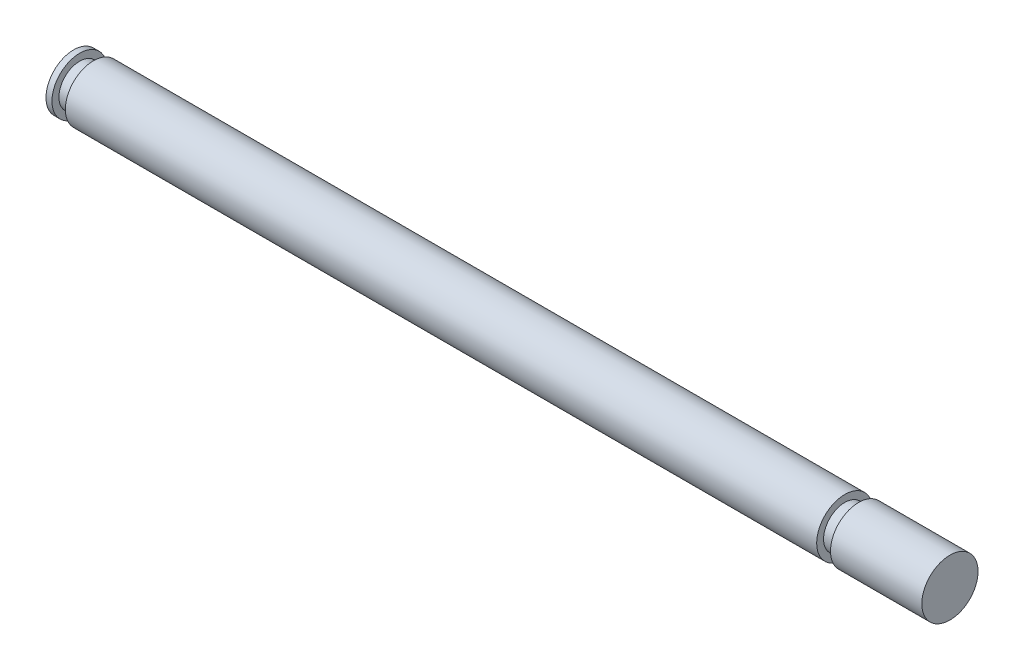
ISO-10303-21;
HEADER;
FILE_DESCRIPTION(('STEP AP214'),'2;1');
FILE_NAME('part.step','',(''),(''),'','','');
FILE_SCHEMA(('AUTOMOTIVE_DESIGN { 1 0 10303 214 1 1 1 1 }'));
ENDSEC;
DATA;
#1=APPLICATION_CONTEXT('core data for automotive mechanical design processes');
#2=APPLICATION_PROTOCOL_DEFINITION('international standard','automotive_design',2000,#1);
#3=PRODUCT_CONTEXT('',#1,'mechanical');
#4=PRODUCT('Part','Part','',(#3));
#5=PRODUCT_RELATED_PRODUCT_CATEGORY('part','',(#4));
#6=PRODUCT_DEFINITION_FORMATION('','',#4);
#7=PRODUCT_DEFINITION_CONTEXT('part definition',#1,'design');
#8=PRODUCT_DEFINITION('design','',#6,#7);
#9=PRODUCT_DEFINITION_SHAPE('','',#8);
#10=(LENGTH_UNIT() NAMED_UNIT(*) SI_UNIT(.MILLI.,.METRE.));
#11=(NAMED_UNIT(*) PLANE_ANGLE_UNIT() SI_UNIT($,.RADIAN.));
#12=(NAMED_UNIT(*) SI_UNIT($,.STERADIAN.) SOLID_ANGLE_UNIT());
#13=UNCERTAINTY_MEASURE_WITH_UNIT(LENGTH_MEASURE(1.E-05),#10,'distance_accuracy_value','');
#14=(GEOMETRIC_REPRESENTATION_CONTEXT(3) GLOBAL_UNCERTAINTY_ASSIGNED_CONTEXT((#13)) GLOBAL_UNIT_ASSIGNED_CONTEXT((#10,
#11,#12)) REPRESENTATION_CONTEXT('',''));
#15=CARTESIAN_POINT('',(0.,0.,0.));
#16=DIRECTION('',(0.,0.,1.));
#17=DIRECTION('',(1.,0.,0.));
#18=AXIS2_PLACEMENT_3D('',#15,#16,#17);
#19=CARTESIAN_POINT('',(1583.,0.,0.));
#20=DIRECTION('',(-1.,0.,0.));
#21=DIRECTION('',(0.,0.,1.));
#22=AXIS2_PLACEMENT_3D('',#19,#20,#21);
#23=PLANE('',#22);
#24=CARTESIAN_POINT('',(1583.,0.,0.));
#25=DIRECTION('',(-1.,0.,0.));
#26=DIRECTION('',(0.,0.,1.));
#27=AXIS2_PLACEMENT_3D('',#24,#25,#26);
#28=CIRCLE('',#27,50.8317734588424);
#29=CARTESIAN_POINT('',(1583.,0.,50.8317734588424));
#30=VERTEX_POINT('',#29);
#31=EDGE_CURVE('E10',#30,#30,#28,.T.);
#32=ORIENTED_EDGE('',*,*,#31,.F.);
#33=EDGE_LOOP('',(#32));
#34=FACE_BOUND('',#33,.T.);
#35=ADVANCED_FACE('F31',(#34),#23,.F.);
#36=CARTESIAN_POINT('',(0.,0.,0.));
#37=DIRECTION('',(-1.,0.,0.));
#38=DIRECTION('',(0.,0.,1.));
#39=AXIS2_PLACEMENT_3D('',#36,#37,#38);
#40=CYLINDRICAL_SURFACE('',#39,50.8317734588424);
#41=CARTESIAN_POINT('',(1418.1,0.,0.));
#42=DIRECTION('',(-1.,0.,0.));
#43=DIRECTION('',(0.,0.,1.));
#44=AXIS2_PLACEMENT_3D('',#41,#42,#43);
#45=CIRCLE('',#44,50.8317734588424);
#46=CARTESIAN_POINT('',(1418.1,0.,50.8317734588424));
#47=VERTEX_POINT('',#46);
#48=EDGE_CURVE('E37',#47,#47,#45,.T.);
#49=ORIENTED_EDGE('',*,*,#48,.F.);
#50=EDGE_LOOP('',(#49));
#51=FACE_BOUND('',#50,.T.);
#52=ORIENTED_EDGE('',*,*,#31,.T.);
#53=EDGE_LOOP('',(#52));
#54=FACE_BOUND('',#53,.T.);
#55=ADVANCED_FACE('F115',(#51,#54),#40,.T.);
#56=CARTESIAN_POINT('',(1418.1,50.8317734588424,0.));
#57=DIRECTION('',(1.,0.,0.));
#58=DIRECTION('',(0.,0.,-1.));
#59=AXIS2_PLACEMENT_3D('',#56,#57,#58);
#60=PLANE('',#59);
#61=CARTESIAN_POINT('',(1418.1,0.,0.));
#62=DIRECTION('',(-1.,0.,0.));
#63=DIRECTION('',(0.,0.,1.));
#64=AXIS2_PLACEMENT_3D('',#61,#62,#63);
#65=CIRCLE('',#64,38.3317734588424);
#66=CARTESIAN_POINT('',(1418.1,0.,38.3317734588424));
#67=VERTEX_POINT('',#66);
#68=EDGE_CURVE('E41',#67,#67,#65,.T.);
#69=ORIENTED_EDGE('',*,*,#68,.F.);
#70=EDGE_LOOP('',(#69));
#71=FACE_BOUND('',#70,.T.);
#72=ORIENTED_EDGE('',*,*,#48,.T.);
#73=EDGE_LOOP('',(#72));
#74=FACE_BOUND('',#73,.T.);
#75=ADVANCED_FACE('F110',(#71,#74),#60,.F.);
#76=CARTESIAN_POINT('',(0.,0.,0.));
#77=DIRECTION('',(-1.,0.,0.));
#78=DIRECTION('',(0.,0.,1.));
#79=AXIS2_PLACEMENT_3D('',#76,#77,#78);
#80=CYLINDRICAL_SURFACE('',#79,38.3317734588424);
#81=CARTESIAN_POINT('',(1393.1,0.,0.));
#82=DIRECTION('',(-1.,0.,0.));
#83=DIRECTION('',(0.,0.,1.));
#84=AXIS2_PLACEMENT_3D('',#81,#82,#83);
#85=CIRCLE('',#84,38.3317734588424);
#86=CARTESIAN_POINT('',(1393.1,0.,38.3317734588424));
#87=VERTEX_POINT('',#86);
#88=EDGE_CURVE('E45',#87,#87,#85,.T.);
#89=ORIENTED_EDGE('',*,*,#88,.F.);
#90=EDGE_LOOP('',(#89));
#91=FACE_BOUND('',#90,.T.);
#92=ORIENTED_EDGE('',*,*,#68,.T.);
#93=EDGE_LOOP('',(#92));
#94=FACE_BOUND('',#93,.T.);
#95=ADVANCED_FACE('F104',(#91,#94),#80,.T.);
#96=CARTESIAN_POINT('',(1393.1,38.3317734588424,0.));
#97=DIRECTION('',(-1.,0.,0.));
#98=DIRECTION('',(0.,0.,1.));
#99=AXIS2_PLACEMENT_3D('',#96,#97,#98);
#100=PLANE('',#99);
#101=CARTESIAN_POINT('',(1393.1,0.,0.));
#102=DIRECTION('',(-1.,0.,0.));
#103=DIRECTION('',(0.,0.,1.));
#104=AXIS2_PLACEMENT_3D('',#101,#102,#103);
#105=CIRCLE('',#104,50.8317734588424);
#106=CARTESIAN_POINT('',(1393.1,0.,50.8317734588424));
#107=VERTEX_POINT('',#106);
#108=EDGE_CURVE('E50',#107,#107,#105,.T.);
#109=ORIENTED_EDGE('',*,*,#108,.F.);
#110=EDGE_LOOP('',(#109));
#111=FACE_BOUND('',#110,.T.);
#112=ORIENTED_EDGE('',*,*,#88,.T.);
#113=EDGE_LOOP('',(#112));
#114=FACE_BOUND('',#113,.T.);
#115=ADVANCED_FACE('F98',(#111,#114),#100,.F.);
#116=CARTESIAN_POINT('',(0.,0.,0.));
#117=DIRECTION('',(-1.,0.,0.));
#118=DIRECTION('',(0.,0.,1.));
#119=AXIS2_PLACEMENT_3D('',#116,#117,#118);
#120=CYLINDRICAL_SURFACE('',#119,50.8317734588424);
#121=CARTESIAN_POINT('',(35.8,0.,0.));
#122=DIRECTION('',(-1.,0.,0.));
#123=DIRECTION('',(0.,0.,1.));
#124=AXIS2_PLACEMENT_3D('',#121,#122,#123);
#125=CIRCLE('',#124,50.8317734588424);
#126=CARTESIAN_POINT('',(35.8,0.,50.8317734588424));
#127=VERTEX_POINT('',#126);
#128=EDGE_CURVE('E53',#127,#127,#125,.T.);
#129=ORIENTED_EDGE('',*,*,#128,.F.);
#130=EDGE_LOOP('',(#129));
#131=FACE_BOUND('',#130,.T.);
#132=ORIENTED_EDGE('',*,*,#108,.T.);
#133=EDGE_LOOP('',(#132));
#134=FACE_BOUND('',#133,.T.);
#135=ADVANCED_FACE('F92',(#131,#134),#120,.T.);
#136=CARTESIAN_POINT('',(35.8,37.5,0.));
#137=DIRECTION('',(1.,0.,0.));
#138=DIRECTION('',(0.,0.,-1.));
#139=AXIS2_PLACEMENT_3D('',#136,#137,#138);
#140=PLANE('',#139);
#141=CARTESIAN_POINT('',(35.8,0.,0.));
#142=DIRECTION('',(-1.,0.,0.));
#143=DIRECTION('',(0.,0.,1.));
#144=AXIS2_PLACEMENT_3D('',#141,#142,#143);
#145=CIRCLE('',#144,37.5);
#146=CARTESIAN_POINT('',(35.8,0.,37.5));
#147=VERTEX_POINT('',#146);
#148=EDGE_CURVE('E56',#147,#147,#145,.T.);
#149=ORIENTED_EDGE('',*,*,#148,.F.);
#150=EDGE_LOOP('',(#149));
#151=FACE_BOUND('',#150,.T.);
#152=ORIENTED_EDGE('',*,*,#128,.T.);
#153=EDGE_LOOP('',(#152));
#154=FACE_BOUND('',#153,.T.);
#155=ADVANCED_FACE('F86',(#151,#154),#140,.F.);
#156=CARTESIAN_POINT('',(0.,0.,0.));
#157=DIRECTION('',(-1.,0.,0.));
#158=DIRECTION('',(0.,0.,1.));
#159=AXIS2_PLACEMENT_3D('',#156,#157,#158);
#160=CYLINDRICAL_SURFACE('',#159,37.5);
#161=CARTESIAN_POINT('',(10.8,0.,0.));
#162=DIRECTION('',(-1.,0.,0.));
#163=DIRECTION('',(0.,0.,1.));
#164=AXIS2_PLACEMENT_3D('',#161,#162,#163);
#165=CIRCLE('',#164,37.5);
#166=CARTESIAN_POINT('',(10.8,0.,37.5));
#167=VERTEX_POINT('',#166);
#168=EDGE_CURVE('E59',#167,#167,#165,.T.);
#169=ORIENTED_EDGE('',*,*,#168,.F.);
#170=EDGE_LOOP('',(#169));
#171=FACE_BOUND('',#170,.T.);
#172=ORIENTED_EDGE('',*,*,#148,.T.);
#173=EDGE_LOOP('',(#172));
#174=FACE_BOUND('',#173,.T.);
#175=ADVANCED_FACE('F80',(#171,#174),#160,.T.);
#176=CARTESIAN_POINT('',(10.8,50.,0.));
#177=DIRECTION('',(-1.,0.,0.));
#178=DIRECTION('',(0.,0.,1.));
#179=AXIS2_PLACEMENT_3D('',#176,#177,#178);
#180=PLANE('',#179);
#181=CARTESIAN_POINT('',(10.8,0.,0.));
#182=DIRECTION('',(-1.,0.,0.));
#183=DIRECTION('',(0.,0.,1.));
#184=AXIS2_PLACEMENT_3D('',#181,#182,#183);
#185=CIRCLE('',#184,50.);
#186=CARTESIAN_POINT('',(10.8,0.,50.));
#187=VERTEX_POINT('',#186);
#188=EDGE_CURVE('E62',#187,#187,#185,.T.);
#189=ORIENTED_EDGE('',*,*,#188,.F.);
#190=EDGE_LOOP('',(#189));
#191=FACE_BOUND('',#190,.T.);
#192=ORIENTED_EDGE('',*,*,#168,.T.);
#193=EDGE_LOOP('',(#192));
#194=FACE_BOUND('',#193,.T.);
#195=ADVANCED_FACE('F74',(#191,#194),#180,.F.);
#196=CARTESIAN_POINT('',(0.,0.,0.));
#197=DIRECTION('',(-1.,0.,0.));
#198=DIRECTION('',(0.,0.,1.));
#199=AXIS2_PLACEMENT_3D('',#196,#197,#198);
#200=CYLINDRICAL_SURFACE('',#199,50.);
#201=CARTESIAN_POINT('',(0.,0.,0.));
#202=DIRECTION('',(-1.,0.,0.));
#203=DIRECTION('',(0.,0.,1.));
#204=AXIS2_PLACEMENT_3D('',#201,#202,#203);
#205=CIRCLE('',#204,50.);
#206=CARTESIAN_POINT('',(0.,0.,50.));
#207=VERTEX_POINT('',#206);
#208=EDGE_CURVE('E65',#207,#207,#205,.T.);
#209=ORIENTED_EDGE('',*,*,#208,.F.);
#210=EDGE_LOOP('',(#209));
#211=FACE_BOUND('',#210,.T.);
#212=ORIENTED_EDGE('',*,*,#188,.T.);
#213=EDGE_LOOP('',(#212));
#214=FACE_BOUND('',#213,.T.);
#215=ADVANCED_FACE('F71',(#211,#214),#200,.T.);
#216=CARTESIAN_POINT('',(0.,0.,0.));
#217=DIRECTION('',(1.,0.,0.));
#218=DIRECTION('',(0.,0.,-1.));
#219=AXIS2_PLACEMENT_3D('',#216,#217,#218);
#220=PLANE('',#219);
#221=ORIENTED_EDGE('',*,*,#208,.T.);
#222=EDGE_LOOP('',(#221));
#223=FACE_BOUND('',#222,.T.);
#224=ADVANCED_FACE('F69',(#223),#220,.F.);
#225=CLOSED_SHELL('',(#35,#55,#75,#95,#115,#135,#155,#175,#195,#215,#224));
#226=MANIFOLD_SOLID_BREP('B2',#225);
#227=ADVANCED_BREP_SHAPE_REPRESENTATION('',(#18,#226),#14);
#228=SHAPE_DEFINITION_REPRESENTATION(#9,#227);
ENDSEC;
END-ISO-10303-21;
